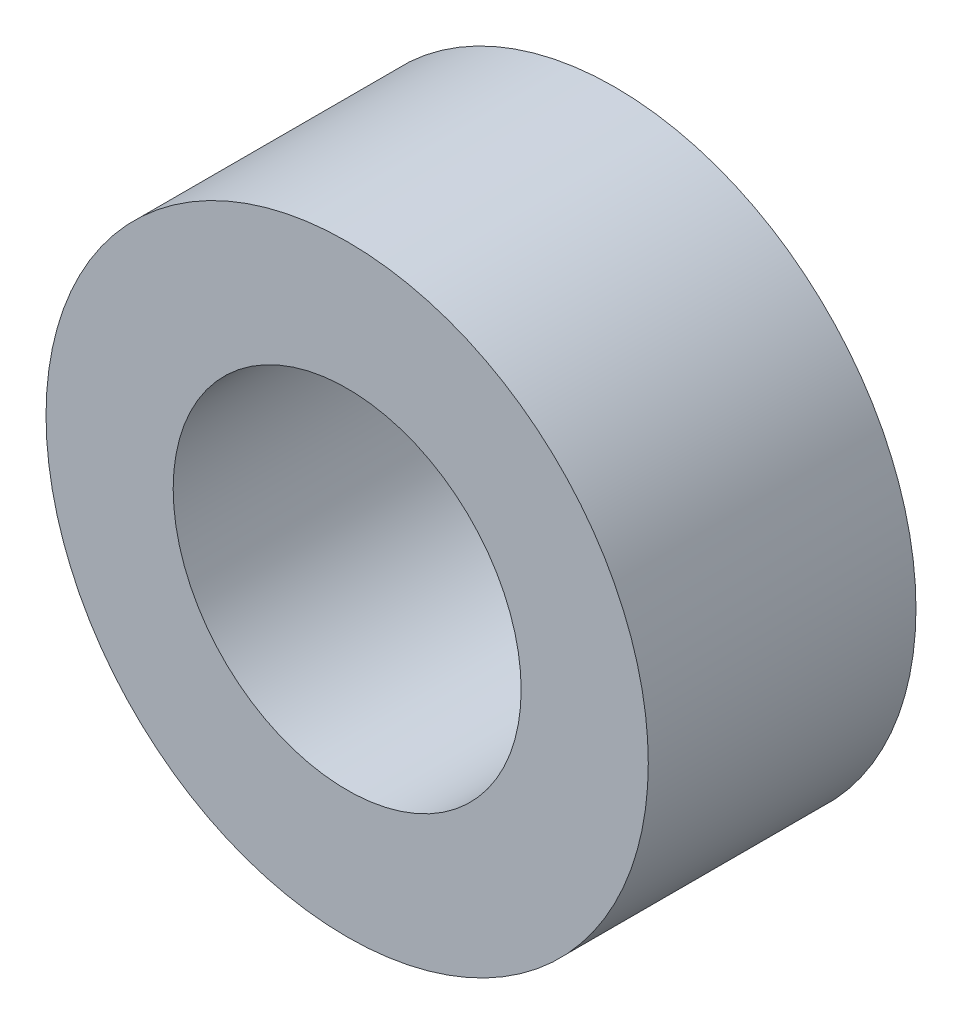
ISO-10303-21;
HEADER;
FILE_DESCRIPTION(('STEP AP214'),'2;1');
FILE_NAME('part.step','',(''),(''),'','','');
FILE_SCHEMA(('AUTOMOTIVE_DESIGN { 1 0 10303 214 1 1 1 1 }'));
ENDSEC;
DATA;
#1=APPLICATION_CONTEXT('core data for automotive mechanical design processes');
#2=APPLICATION_PROTOCOL_DEFINITION('international standard','automotive_design',2000,#1);
#3=PRODUCT_CONTEXT('',#1,'mechanical');
#4=PRODUCT('Part','Part','',(#3));
#5=PRODUCT_RELATED_PRODUCT_CATEGORY('part','',(#4));
#6=PRODUCT_DEFINITION_FORMATION('','',#4);
#7=PRODUCT_DEFINITION_CONTEXT('part definition',#1,'design');
#8=PRODUCT_DEFINITION('design','',#6,#7);
#9=PRODUCT_DEFINITION_SHAPE('','',#8);
#10=(LENGTH_UNIT() NAMED_UNIT(*) SI_UNIT(.MILLI.,.METRE.));
#11=(NAMED_UNIT(*) PLANE_ANGLE_UNIT() SI_UNIT($,.RADIAN.));
#12=(NAMED_UNIT(*) SI_UNIT($,.STERADIAN.) SOLID_ANGLE_UNIT());
#13=UNCERTAINTY_MEASURE_WITH_UNIT(LENGTH_MEASURE(1.E-05),#10,'distance_accuracy_value','');
#14=(GEOMETRIC_REPRESENTATION_CONTEXT(3) GLOBAL_UNCERTAINTY_ASSIGNED_CONTEXT((#13)) GLOBAL_UNIT_ASSIGNED_CONTEXT((#10,
#11,#12)) REPRESENTATION_CONTEXT('',''));
#15=CARTESIAN_POINT('',(0.,0.,0.));
#16=DIRECTION('',(0.,0.,1.));
#17=DIRECTION('',(1.,0.,0.));
#18=AXIS2_PLACEMENT_3D('',#15,#16,#17);
#19=CARTESIAN_POINT('',(0.,0.,4.));
#20=DIRECTION('',(0.,0.,-1.));
#21=DIRECTION('',(-1.,0.,0.));
#22=AXIS2_PLACEMENT_3D('',#19,#20,#21);
#23=CYLINDRICAL_SURFACE('',#22,4.5);
#24=CARTESIAN_POINT('',(0.,0.,4.));
#25=DIRECTION('',(0.,0.,1.));
#26=DIRECTION('',(1.,0.,0.));
#27=AXIS2_PLACEMENT_3D('',#24,#25,#26);
#28=CIRCLE('',#27,4.5);
#29=CARTESIAN_POINT('',(4.5,0.,4.));
#30=VERTEX_POINT('',#29);
#31=EDGE_CURVE('E10',#30,#30,#28,.T.);
#32=ORIENTED_EDGE('',*,*,#31,.F.);
#33=EDGE_LOOP('',(#32));
#34=FACE_BOUND('',#33,.T.);
#35=CARTESIAN_POINT('',(0.,0.,0.));
#36=DIRECTION('',(0.,0.,1.));
#37=DIRECTION('',(1.,0.,0.));
#38=AXIS2_PLACEMENT_3D('',#35,#36,#37);
#39=CIRCLE('',#38,4.5);
#40=CARTESIAN_POINT('',(4.5,0.,0.));
#41=VERTEX_POINT('',#40);
#42=EDGE_CURVE('E40',#41,#41,#39,.T.);
#43=ORIENTED_EDGE('',*,*,#42,.T.);
#44=EDGE_LOOP('',(#43));
#45=FACE_BOUND('',#44,.T.);
#46=ADVANCED_FACE('F37',(#34,#45),#23,.T.);
#47=CARTESIAN_POINT('',(0.,0.,4.));
#48=DIRECTION('',(0.,0.,1.));
#49=DIRECTION('',(1.,0.,0.));
#50=AXIS2_PLACEMENT_3D('',#47,#48,#49);
#51=PLANE('',#50);
#52=CARTESIAN_POINT('',(0.,0.,4.));
#53=DIRECTION('',(0.,0.,1.));
#54=DIRECTION('',(1.,0.,0.));
#55=AXIS2_PLACEMENT_3D('',#52,#53,#54);
#56=CIRCLE('',#55,2.6);
#57=CARTESIAN_POINT('',(2.6,0.,4.));
#58=VERTEX_POINT('',#57);
#59=EDGE_CURVE('E51',#58,#58,#56,.T.);
#60=ORIENTED_EDGE('',*,*,#59,.F.);
#61=EDGE_LOOP('',(#60));
#62=FACE_BOUND('',#61,.T.);
#63=ORIENTED_EDGE('',*,*,#31,.T.);
#64=EDGE_LOOP('',(#63));
#65=FACE_BOUND('',#64,.T.);
#66=ADVANCED_FACE('F68',(#62,#65),#51,.T.);
#67=CARTESIAN_POINT('',(0.,0.,0.));
#68=DIRECTION('',(0.,0.,1.));
#69=DIRECTION('',(1.,0.,0.));
#70=AXIS2_PLACEMENT_3D('',#67,#68,#69);
#71=PLANE('',#70);
#72=CARTESIAN_POINT('',(0.,0.,0.));
#73=DIRECTION('',(0.,0.,1.));
#74=DIRECTION('',(1.,0.,0.));
#75=AXIS2_PLACEMENT_3D('',#72,#73,#74);
#76=CIRCLE('',#75,2.6);
#77=CARTESIAN_POINT('',(2.6,0.,0.));
#78=VERTEX_POINT('',#77);
#79=EDGE_CURVE('E49',#78,#78,#76,.T.);
#80=ORIENTED_EDGE('',*,*,#79,.T.);
#81=EDGE_LOOP('',(#80));
#82=FACE_BOUND('',#81,.T.);
#83=ORIENTED_EDGE('',*,*,#42,.F.);
#84=EDGE_LOOP('',(#83));
#85=FACE_BOUND('',#84,.T.);
#86=ADVANCED_FACE('F59',(#82,#85),#71,.F.);
#87=CARTESIAN_POINT('',(0.,0.,0.));
#88=DIRECTION('',(0.,0.,1.));
#89=DIRECTION('',(1.,0.,0.));
#90=AXIS2_PLACEMENT_3D('',#87,#88,#89);
#91=CYLINDRICAL_SURFACE('',#90,2.6);
#92=ORIENTED_EDGE('',*,*,#79,.F.);
#93=EDGE_LOOP('',(#92));
#94=FACE_BOUND('',#93,.T.);
#95=ORIENTED_EDGE('',*,*,#59,.T.);
#96=EDGE_LOOP('',(#95));
#97=FACE_BOUND('',#96,.T.);
#98=ADVANCED_FACE('F62',(#94,#97),#91,.F.);
#99=CLOSED_SHELL('',(#46,#66,#86,#98));
#100=MANIFOLD_SOLID_BREP('B2',#99);
#101=ADVANCED_BREP_SHAPE_REPRESENTATION('',(#18,#100),#14);
#102=SHAPE_DEFINITION_REPRESENTATION(#9,#101);
ENDSEC;
END-ISO-10303-21;
